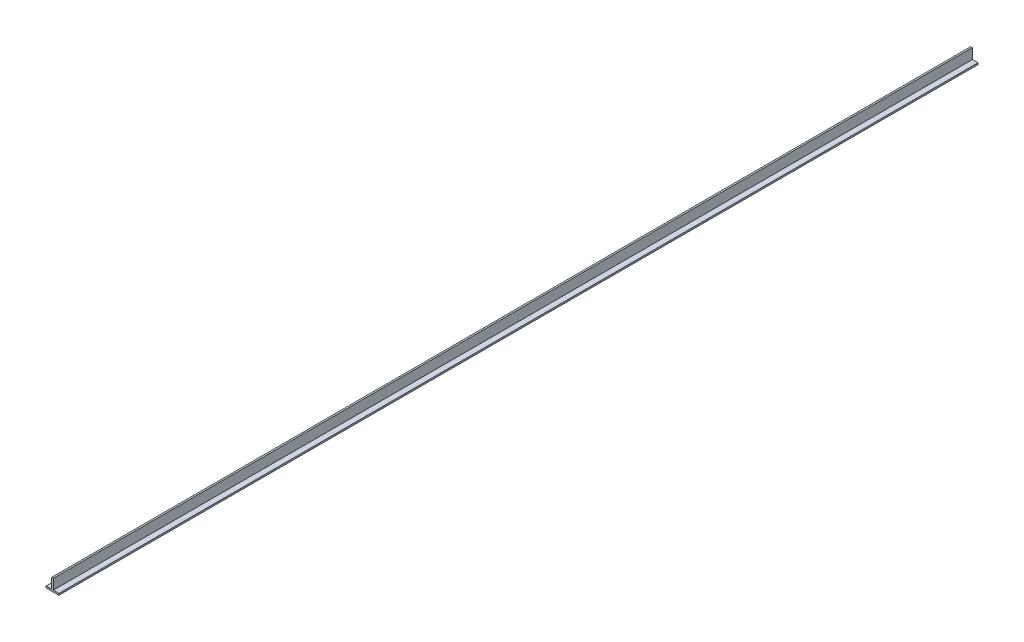
ISO-10303-21;
HEADER;
FILE_DESCRIPTION(('STEP AP214'),'2;1');
FILE_NAME('part.step','',(''),(''),'','','');
FILE_SCHEMA(('AUTOMOTIVE_DESIGN { 1 0 10303 214 1 1 1 1 }'));
ENDSEC;
DATA;
#1=APPLICATION_CONTEXT('core data for automotive mechanical design processes');
#2=APPLICATION_PROTOCOL_DEFINITION('international standard','automotive_design',2000,#1);
#3=PRODUCT_CONTEXT('',#1,'mechanical');
#4=PRODUCT('Part','Part','',(#3));
#5=PRODUCT_RELATED_PRODUCT_CATEGORY('part','',(#4));
#6=PRODUCT_DEFINITION_FORMATION('','',#4);
#7=PRODUCT_DEFINITION_CONTEXT('part definition',#1,'design');
#8=PRODUCT_DEFINITION('design','',#6,#7);
#9=PRODUCT_DEFINITION_SHAPE('','',#8);
#10=(LENGTH_UNIT() NAMED_UNIT(*) SI_UNIT(.MILLI.,.METRE.));
#11=(NAMED_UNIT(*) PLANE_ANGLE_UNIT() SI_UNIT($,.RADIAN.));
#12=(NAMED_UNIT(*) SI_UNIT($,.STERADIAN.) SOLID_ANGLE_UNIT());
#13=UNCERTAINTY_MEASURE_WITH_UNIT(LENGTH_MEASURE(1.E-05),#10,'distance_accuracy_value','');
#14=(GEOMETRIC_REPRESENTATION_CONTEXT(3) GLOBAL_UNCERTAINTY_ASSIGNED_CONTEXT((#13)) GLOBAL_UNIT_ASSIGNED_CONTEXT((#10,
#11,#12)) REPRESENTATION_CONTEXT('',''));
#15=CARTESIAN_POINT('',(0.,0.,0.));
#16=DIRECTION('',(0.,0.,1.));
#17=DIRECTION('',(1.,0.,0.));
#18=AXIS2_PLACEMENT_3D('',#15,#16,#17);
#19=CARTESIAN_POINT('',(-4.50000000000001,65.,5000.));
#20=DIRECTION('',(1.,0.,0.));
#21=DIRECTION('',(0.,1.,0.));
#22=AXIS2_PLACEMENT_3D('',#19,#20,#21);
#23=PLANE('',#22);
#24=DIRECTION('',(0.,-1.,0.));
#25=VECTOR('',#24,1.);
#26=CARTESIAN_POINT('',(-4.50000000000001,65.,0.));
#27=LINE('',#26,#25);
#28=CARTESIAN_POINT('',(-4.50000000000001,65.,0.));
#29=VERTEX_POINT('',#28);
#30=CARTESIAN_POINT('',(-4.5,9.,0.));
#31=VERTEX_POINT('',#30);
#32=EDGE_CURVE('E128',#29,#31,#27,.T.);
#33=ORIENTED_EDGE('',*,*,#32,.T.);
#34=DIRECTION('',(0.,0.,-1.));
#35=VECTOR('',#34,1.);
#36=CARTESIAN_POINT('',(-4.5,9.,5000.));
#37=LINE('',#36,#35);
#38=CARTESIAN_POINT('',(-4.5,9.,5000.));
#39=VERTEX_POINT('',#38);
#40=EDGE_CURVE('E11',#39,#31,#37,.T.);
#41=ORIENTED_EDGE('',*,*,#40,.F.);
#42=DIRECTION('',(0.,-1.,0.));
#43=VECTOR('',#42,1.);
#44=CARTESIAN_POINT('',(-4.50000000000001,65.,5000.));
#45=LINE('',#44,#43);
#46=CARTESIAN_POINT('',(-4.50000000000001,65.,5000.));
#47=VERTEX_POINT('',#46);
#48=EDGE_CURVE('E142',#47,#39,#45,.T.);
#49=ORIENTED_EDGE('',*,*,#48,.F.);
#50=DIRECTION('',(0.,0.,-1.));
#51=VECTOR('',#50,1.);
#52=CARTESIAN_POINT('',(-4.50000000000001,65.,5000.));
#53=LINE('',#52,#51);
#54=EDGE_CURVE('E124',#47,#29,#53,.T.);
#55=ORIENTED_EDGE('',*,*,#54,.T.);
#56=EDGE_LOOP('',(#33,#41,#49,#55));
#57=FACE_BOUND('',#56,.T.);
#58=ADVANCED_FACE('F32',(#57),#23,.F.);
#59=CARTESIAN_POINT('',(-4.5,9.,5000.));
#60=DIRECTION('',(0.,-1.,0.));
#61=DIRECTION('',(1.,0.,0.));
#62=AXIS2_PLACEMENT_3D('',#59,#60,#61);
#63=PLANE('',#62);
#64=DIRECTION('',(-1.,0.,0.));
#65=VECTOR('',#64,1.);
#66=CARTESIAN_POINT('',(-4.5,9.,0.));
#67=LINE('',#66,#65);
#68=CARTESIAN_POINT('',(-35.,9.,0.));
#69=VERTEX_POINT('',#68);
#70=EDGE_CURVE('E131',#31,#69,#67,.T.);
#71=ORIENTED_EDGE('',*,*,#70,.T.);
#72=DIRECTION('',(0.,0.,-1.));
#73=VECTOR('',#72,1.);
#74=CARTESIAN_POINT('',(-35.,9.,5000.));
#75=LINE('',#74,#73);
#76=CARTESIAN_POINT('',(-35.,9.,5000.));
#77=VERTEX_POINT('',#76);
#78=EDGE_CURVE('E40',#77,#69,#75,.T.);
#79=ORIENTED_EDGE('',*,*,#78,.F.);
#80=DIRECTION('',(-1.,0.,0.));
#81=VECTOR('',#80,1.);
#82=CARTESIAN_POINT('',(-4.5,9.,5000.));
#83=LINE('',#82,#81);
#84=EDGE_CURVE('E91',#39,#77,#83,.T.);
#85=ORIENTED_EDGE('',*,*,#84,.F.);
#86=ORIENTED_EDGE('',*,*,#40,.T.);
#87=EDGE_LOOP('',(#71,#79,#85,#86));
#88=FACE_BOUND('',#87,.T.);
#89=ADVANCED_FACE('F177',(#88),#63,.F.);
#90=CARTESIAN_POINT('',(-35.,9.,5000.));
#91=DIRECTION('',(1.,0.,0.));
#92=DIRECTION('',(0.,0.,-1.));
#93=AXIS2_PLACEMENT_3D('',#90,#91,#92);
#94=PLANE('',#93);
#95=DIRECTION('',(0.,-1.,0.));
#96=VECTOR('',#95,1.);
#97=CARTESIAN_POINT('',(-35.,9.,0.));
#98=LINE('',#97,#96);
#99=CARTESIAN_POINT('',(-35.,0.,0.));
#100=VERTEX_POINT('',#99);
#101=EDGE_CURVE('E133',#69,#100,#98,.T.);
#102=ORIENTED_EDGE('',*,*,#101,.T.);
#103=DIRECTION('',(0.,0.,-1.));
#104=VECTOR('',#103,1.);
#105=CARTESIAN_POINT('',(-35.,0.,5000.));
#106=LINE('',#105,#104);
#107=CARTESIAN_POINT('',(-35.,0.,5000.));
#108=VERTEX_POINT('',#107);
#109=EDGE_CURVE('E149',#108,#100,#106,.T.);
#110=ORIENTED_EDGE('',*,*,#109,.F.);
#111=DIRECTION('',(0.,-1.,0.));
#112=VECTOR('',#111,1.);
#113=CARTESIAN_POINT('',(-35.,9.,5000.));
#114=LINE('',#113,#112);
#115=EDGE_CURVE('E157',#77,#108,#114,.T.);
#116=ORIENTED_EDGE('',*,*,#115,.F.);
#117=ORIENTED_EDGE('',*,*,#78,.T.);
#118=EDGE_LOOP('',(#102,#110,#116,#117));
#119=FACE_BOUND('',#118,.T.);
#120=ADVANCED_FACE('F155',(#119),#94,.F.);
#121=CARTESIAN_POINT('',(-35.,0.,5000.));
#122=DIRECTION('',(0.,1.,0.));
#123=DIRECTION('',(0.,0.,1.));
#124=AXIS2_PLACEMENT_3D('',#121,#122,#123);
#125=PLANE('',#124);
#126=DIRECTION('',(1.,0.,0.));
#127=VECTOR('',#126,1.);
#128=CARTESIAN_POINT('',(-35.,0.,0.));
#129=LINE('',#128,#127);
#130=CARTESIAN_POINT('',(35.,0.,0.));
#131=VERTEX_POINT('',#130);
#132=EDGE_CURVE('E135',#100,#131,#129,.T.);
#133=ORIENTED_EDGE('',*,*,#132,.T.);
#134=DIRECTION('',(0.,0.,-1.));
#135=VECTOR('',#134,1.);
#136=CARTESIAN_POINT('',(35.,0.,5000.));
#137=LINE('',#136,#135);
#138=CARTESIAN_POINT('',(35.,0.,5000.));
#139=VERTEX_POINT('',#138);
#140=EDGE_CURVE('E146',#139,#131,#137,.T.);
#141=ORIENTED_EDGE('',*,*,#140,.F.);
#142=DIRECTION('',(1.,0.,0.));
#143=VECTOR('',#142,1.);
#144=CARTESIAN_POINT('',(-35.,0.,5000.));
#145=LINE('',#144,#143);
#146=EDGE_CURVE('E169',#108,#139,#145,.T.);
#147=ORIENTED_EDGE('',*,*,#146,.F.);
#148=ORIENTED_EDGE('',*,*,#109,.T.);
#149=EDGE_LOOP('',(#133,#141,#147,#148));
#150=FACE_BOUND('',#149,.T.);
#151=ADVANCED_FACE('F165',(#150),#125,.F.);
#152=CARTESIAN_POINT('',(35.,9.00000000000001,5000.));
#153=DIRECTION('',(-1.,0.,0.));
#154=DIRECTION('',(0.,0.,1.));
#155=AXIS2_PLACEMENT_3D('',#152,#153,#154);
#156=PLANE('',#155);
#157=DIRECTION('',(0.,1.,0.));
#158=VECTOR('',#157,1.);
#159=CARTESIAN_POINT('',(35.,9.00000000000001,0.));
#160=LINE('',#159,#158);
#161=CARTESIAN_POINT('',(35.,9.00000000000001,0.));
#162=VERTEX_POINT('',#161);
#163=EDGE_CURVE('E137',#131,#162,#160,.T.);
#164=ORIENTED_EDGE('',*,*,#163,.T.);
#165=DIRECTION('',(0.,0.,-1.));
#166=VECTOR('',#165,1.);
#167=CARTESIAN_POINT('',(35.,9.00000000000001,5000.));
#168=LINE('',#167,#166);
#169=CARTESIAN_POINT('',(35.,9.00000000000001,5000.));
#170=VERTEX_POINT('',#169);
#171=EDGE_CURVE('E119',#170,#162,#168,.T.);
#172=ORIENTED_EDGE('',*,*,#171,.F.);
#173=DIRECTION('',(0.,1.,0.));
#174=VECTOR('',#173,1.);
#175=CARTESIAN_POINT('',(35.,9.00000000000001,5000.));
#176=LINE('',#175,#174);
#177=EDGE_CURVE('E110',#139,#170,#176,.T.);
#178=ORIENTED_EDGE('',*,*,#177,.F.);
#179=ORIENTED_EDGE('',*,*,#140,.T.);
#180=EDGE_LOOP('',(#164,#172,#178,#179));
#181=FACE_BOUND('',#180,.T.);
#182=ADVANCED_FACE('F168',(#181),#156,.F.);
#183=CARTESIAN_POINT('',(4.5,9.,5000.));
#184=DIRECTION('',(0.,-1.,0.));
#185=DIRECTION('',(1.,0.,0.));
#186=AXIS2_PLACEMENT_3D('',#183,#184,#185);
#187=PLANE('',#186);
#188=DIRECTION('',(-1.,0.,0.));
#189=VECTOR('',#188,1.);
#190=CARTESIAN_POINT('',(4.5,9.,0.));
#191=LINE('',#190,#189);
#192=CARTESIAN_POINT('',(4.5,9.,0.));
#193=VERTEX_POINT('',#192);
#194=EDGE_CURVE('E118',#162,#193,#191,.T.);
#195=ORIENTED_EDGE('',*,*,#194,.T.);
#196=DIRECTION('',(0.,0.,-1.));
#197=VECTOR('',#196,1.);
#198=CARTESIAN_POINT('',(4.5,9.,5000.));
#199=LINE('',#198,#197);
#200=CARTESIAN_POINT('',(4.5,9.,5000.));
#201=VERTEX_POINT('',#200);
#202=EDGE_CURVE('E115',#201,#193,#199,.T.);
#203=ORIENTED_EDGE('',*,*,#202,.F.);
#204=DIRECTION('',(-1.,0.,0.));
#205=VECTOR('',#204,1.);
#206=CARTESIAN_POINT('',(4.5,9.,5000.));
#207=LINE('',#206,#205);
#208=EDGE_CURVE('E104',#170,#201,#207,.T.);
#209=ORIENTED_EDGE('',*,*,#208,.F.);
#210=ORIENTED_EDGE('',*,*,#171,.T.);
#211=EDGE_LOOP('',(#195,#203,#209,#210));
#212=FACE_BOUND('',#211,.T.);
#213=ADVANCED_FACE('F116',(#212),#187,.F.);
#214=CARTESIAN_POINT('',(4.49999999999999,65.,5000.));
#215=DIRECTION('',(-1.,0.,0.));
#216=DIRECTION('',(0.,-1.,0.));
#217=AXIS2_PLACEMENT_3D('',#214,#215,#216);
#218=PLANE('',#217);
#219=DIRECTION('',(0.,1.,0.));
#220=VECTOR('',#219,1.);
#221=CARTESIAN_POINT('',(4.49999999999999,65.,0.));
#222=LINE('',#221,#220);
#223=CARTESIAN_POINT('',(4.49999999999999,65.,0.));
#224=VERTEX_POINT('',#223);
#225=EDGE_CURVE('E77',#193,#224,#222,.T.);
#226=ORIENTED_EDGE('',*,*,#225,.T.);
#227=DIRECTION('',(0.,0.,-1.));
#228=VECTOR('',#227,1.);
#229=CARTESIAN_POINT('',(4.49999999999999,65.,5000.));
#230=LINE('',#229,#228);
#231=CARTESIAN_POINT('',(4.49999999999999,65.,5000.));
#232=VERTEX_POINT('',#231);
#233=EDGE_CURVE('E120',#232,#224,#230,.T.);
#234=ORIENTED_EDGE('',*,*,#233,.F.);
#235=DIRECTION('',(0.,1.,0.));
#236=VECTOR('',#235,1.);
#237=CARTESIAN_POINT('',(4.49999999999999,65.,5000.));
#238=LINE('',#237,#236);
#239=EDGE_CURVE('E108',#201,#232,#238,.T.);
#240=ORIENTED_EDGE('',*,*,#239,.F.);
#241=ORIENTED_EDGE('',*,*,#202,.T.);
#242=EDGE_LOOP('',(#226,#234,#240,#241));
#243=FACE_BOUND('',#242,.T.);
#244=ADVANCED_FACE('F122',(#243),#218,.F.);
#245=CARTESIAN_POINT('',(4.49999999999999,65.,5000.));
#246=DIRECTION('',(0.,-1.,0.));
#247=DIRECTION('',(0.,0.,-1.));
#248=AXIS2_PLACEMENT_3D('',#245,#246,#247);
#249=PLANE('',#248);
#250=DIRECTION('',(-1.,0.,0.));
#251=VECTOR('',#250,1.);
#252=CARTESIAN_POINT('',(4.49999999999999,65.,0.));
#253=LINE('',#252,#251);
#254=EDGE_CURVE('E83',#224,#29,#253,.T.);
#255=ORIENTED_EDGE('',*,*,#254,.T.);
#256=ORIENTED_EDGE('',*,*,#54,.F.);
#257=DIRECTION('',(-1.,0.,0.));
#258=VECTOR('',#257,1.);
#259=CARTESIAN_POINT('',(4.49999999999999,65.,5000.));
#260=LINE('',#259,#258);
#261=EDGE_CURVE('E48',#232,#47,#260,.T.);
#262=ORIENTED_EDGE('',*,*,#261,.F.);
#263=ORIENTED_EDGE('',*,*,#233,.T.);
#264=EDGE_LOOP('',(#255,#256,#262,#263));
#265=FACE_BOUND('',#264,.T.);
#266=ADVANCED_FACE('F193',(#265),#249,.F.);
#267=CARTESIAN_POINT('',(0.,0.,5000.));
#268=DIRECTION('',(0.,0.,-1.));
#269=DIRECTION('',(-1.,0.,0.));
#270=AXIS2_PLACEMENT_3D('',#267,#268,#269);
#271=PLANE('',#270);
#272=ORIENTED_EDGE('',*,*,#48,.T.);
#273=ORIENTED_EDGE('',*,*,#84,.T.);
#274=ORIENTED_EDGE('',*,*,#115,.T.);
#275=ORIENTED_EDGE('',*,*,#146,.T.);
#276=ORIENTED_EDGE('',*,*,#177,.T.);
#277=ORIENTED_EDGE('',*,*,#208,.T.);
#278=ORIENTED_EDGE('',*,*,#239,.T.);
#279=ORIENTED_EDGE('',*,*,#261,.T.);
#280=EDGE_LOOP('',(#272,#273,#274,#275,#276,#277,#278,#279));
#281=FACE_BOUND('',#280,.T.);
#282=ADVANCED_FACE('F106',(#281),#271,.F.);
#283=CARTESIAN_POINT('',(0.,0.,0.));
#284=DIRECTION('',(0.,0.,-1.));
#285=DIRECTION('',(-1.,0.,0.));
#286=AXIS2_PLACEMENT_3D('',#283,#284,#285);
#287=PLANE('',#286);
#288=ORIENTED_EDGE('',*,*,#32,.F.);
#289=ORIENTED_EDGE('',*,*,#254,.F.);
#290=ORIENTED_EDGE('',*,*,#225,.F.);
#291=ORIENTED_EDGE('',*,*,#194,.F.);
#292=ORIENTED_EDGE('',*,*,#163,.F.);
#293=ORIENTED_EDGE('',*,*,#132,.F.);
#294=ORIENTED_EDGE('',*,*,#101,.F.);
#295=ORIENTED_EDGE('',*,*,#70,.F.);
#296=EDGE_LOOP('',(#288,#289,#290,#291,#292,#293,#294,#295));
#297=FACE_BOUND('',#296,.T.);
#298=ADVANCED_FACE('F161',(#297),#287,.T.);
#299=CLOSED_SHELL('',(#58,#89,#120,#151,#182,#213,#244,#266,#282,#298));
#300=MANIFOLD_SOLID_BREP('B2',#299);
#301=ADVANCED_BREP_SHAPE_REPRESENTATION('',(#18,#300),#14);
#302=SHAPE_DEFINITION_REPRESENTATION(#9,#301);
ENDSEC;
END-ISO-10303-21;
